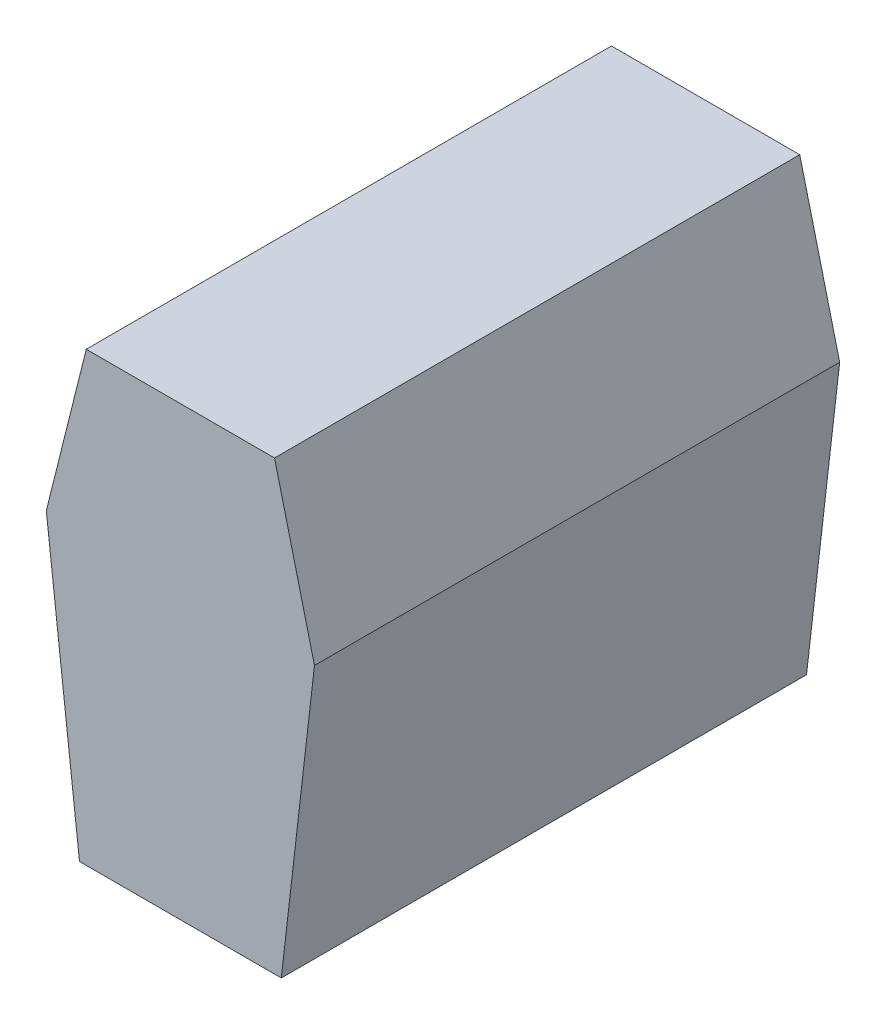
ISO-10303-21;
HEADER;
FILE_DESCRIPTION(('STEP AP214'),'2;1');
FILE_NAME('part.step','',(''),(''),'','','');
FILE_SCHEMA(('AUTOMOTIVE_DESIGN { 1 0 10303 214 1 1 1 1 }'));
ENDSEC;
DATA;
#1=APPLICATION_CONTEXT('core data for automotive mechanical design processes');
#2=APPLICATION_PROTOCOL_DEFINITION('international standard','automotive_design',2000,#1);
#3=PRODUCT_CONTEXT('',#1,'mechanical');
#4=PRODUCT('Part','Part','',(#3));
#5=PRODUCT_RELATED_PRODUCT_CATEGORY('part','',(#4));
#6=PRODUCT_DEFINITION_FORMATION('','',#4);
#7=PRODUCT_DEFINITION_CONTEXT('part definition',#1,'design');
#8=PRODUCT_DEFINITION('design','',#6,#7);
#9=PRODUCT_DEFINITION_SHAPE('','',#8);
#10=(LENGTH_UNIT() NAMED_UNIT(*) SI_UNIT(.MILLI.,.METRE.));
#11=(NAMED_UNIT(*) PLANE_ANGLE_UNIT() SI_UNIT($,.RADIAN.));
#12=(NAMED_UNIT(*) SI_UNIT($,.STERADIAN.) SOLID_ANGLE_UNIT());
#13=UNCERTAINTY_MEASURE_WITH_UNIT(LENGTH_MEASURE(1.E-05),#10,'distance_accuracy_value','');
#14=(GEOMETRIC_REPRESENTATION_CONTEXT(3) GLOBAL_UNCERTAINTY_ASSIGNED_CONTEXT((#13)) GLOBAL_UNIT_ASSIGNED_CONTEXT((#10,
#11,#12)) REPRESENTATION_CONTEXT('',''));
#15=CARTESIAN_POINT('',(0.,0.,0.));
#16=DIRECTION('',(0.,0.,1.));
#17=DIRECTION('',(1.,0.,0.));
#18=AXIS2_PLACEMENT_3D('',#15,#16,#17);
#19=CARTESIAN_POINT('',(0.,36.907372929588,32.9));
#20=DIRECTION('',(0.,0.,-1.));
#21=DIRECTION('',(0.,-1.,0.));
#22=AXIS2_PLACEMENT_3D('',#19,#20,#21);
#23=PLANE('',#22);
#24=DIRECTION('',(-1.,0.,0.));
#25=VECTOR('',#24,1.);
#26=CARTESIAN_POINT('',(6.321026426688,23.,32.9));
#27=LINE('',#26,#25);
#28=CARTESIAN_POINT('',(6.321026426688,23.,32.9));
#29=VERTEX_POINT('',#28);
#30=CARTESIAN_POINT('',(-6.321026426688,23.,32.9));
#31=VERTEX_POINT('',#30);
#32=EDGE_CURVE('E23',#29,#31,#27,.T.);
#33=ORIENTED_EDGE('',*,*,#32,.F.);
#34=DIRECTION('',(-0.114699601764954,-0.993400222143604,0.));
#35=VECTOR('',#34,1.);
#36=CARTESIAN_POINT('',(8.398573201787,40.99339663029,32.9));
#37=LINE('',#36,#35);
#38=CARTESIAN_POINT('',(8.398573201787,40.99339663029,32.9));
#39=VERTEX_POINT('',#38);
#40=EDGE_CURVE('E140',#39,#29,#37,.T.);
#41=ORIENTED_EDGE('',*,*,#40,.F.);
#42=DIRECTION('',(0.242535625036098,-0.970142500145391,0.));
#43=VECTOR('',#42,1.);
#44=CARTESIAN_POINT('',(5.89692235936,51.,32.9));
#45=LINE('',#44,#43);
#46=CARTESIAN_POINT('',(5.89692235936,51.,32.9));
#47=VERTEX_POINT('',#46);
#48=EDGE_CURVE('E120',#47,#39,#45,.T.);
#49=ORIENTED_EDGE('',*,*,#48,.F.);
#50=DIRECTION('',(1.,0.,0.));
#51=VECTOR('',#50,1.);
#52=CARTESIAN_POINT('',(-5.89692235936,51.,32.9));
#53=LINE('',#52,#51);
#54=CARTESIAN_POINT('',(-5.89692235936,51.,32.9));
#55=VERTEX_POINT('',#54);
#56=EDGE_CURVE('E126',#55,#47,#53,.T.);
#57=ORIENTED_EDGE('',*,*,#56,.F.);
#58=DIRECTION('',(0.242535625036098,0.970142500145391,0.));
#59=VECTOR('',#58,1.);
#60=CARTESIAN_POINT('',(-8.398573201787,40.99339663029,32.9));
#61=LINE('',#60,#59);
#62=CARTESIAN_POINT('',(-8.398573201787,40.99339663029,32.9));
#63=VERTEX_POINT('',#62);
#64=EDGE_CURVE('E98',#63,#55,#61,.T.);
#65=ORIENTED_EDGE('',*,*,#64,.F.);
#66=DIRECTION('',(-0.114699601764954,0.993400222143604,0.));
#67=VECTOR('',#66,1.);
#68=CARTESIAN_POINT('',(-6.321026426688,23.,32.9));
#69=LINE('',#68,#67);
#70=EDGE_CURVE('E105',#31,#63,#69,.T.);
#71=ORIENTED_EDGE('',*,*,#70,.F.);
#72=EDGE_LOOP('',(#33,#41,#49,#57,#65,#71));
#73=FACE_BOUND('',#72,.T.);
#74=ADVANCED_FACE('F15',(#73),#23,.F.);
#75=CARTESIAN_POINT('',(0.,36.907372929588,0.));
#76=DIRECTION('',(0.,0.,-1.));
#77=DIRECTION('',(0.,-1.,0.));
#78=AXIS2_PLACEMENT_3D('',#75,#76,#77);
#79=PLANE('',#78);
#80=DIRECTION('',(-0.114699601764954,0.993400222143604,0.));
#81=VECTOR('',#80,1.);
#82=CARTESIAN_POINT('',(-6.321026426688,23.,0.));
#83=LINE('',#82,#81);
#84=CARTESIAN_POINT('',(-6.321026426688,23.,0.));
#85=VERTEX_POINT('',#84);
#86=CARTESIAN_POINT('',(-8.398573201787,40.99339663029,0.));
#87=VERTEX_POINT('',#86);
#88=EDGE_CURVE('E84',#85,#87,#83,.T.);
#89=ORIENTED_EDGE('',*,*,#88,.T.);
#90=DIRECTION('',(0.242535625036098,0.970142500145391,0.));
#91=VECTOR('',#90,1.);
#92=CARTESIAN_POINT('',(-8.398573201787,40.99339663029,0.));
#93=LINE('',#92,#91);
#94=CARTESIAN_POINT('',(-5.89692235936,51.,0.));
#95=VERTEX_POINT('',#94);
#96=EDGE_CURVE('E131',#87,#95,#93,.T.);
#97=ORIENTED_EDGE('',*,*,#96,.T.);
#98=DIRECTION('',(1.,0.,0.));
#99=VECTOR('',#98,1.);
#100=CARTESIAN_POINT('',(-5.89692235936,51.,0.));
#101=LINE('',#100,#99);
#102=CARTESIAN_POINT('',(5.89692235936,51.,0.));
#103=VERTEX_POINT('',#102);
#104=EDGE_CURVE('E124',#95,#103,#101,.T.);
#105=ORIENTED_EDGE('',*,*,#104,.T.);
#106=DIRECTION('',(0.242535625036098,-0.970142500145391,0.));
#107=VECTOR('',#106,1.);
#108=CARTESIAN_POINT('',(5.89692235936,51.,0.));
#109=LINE('',#108,#107);
#110=CARTESIAN_POINT('',(8.398573201787,40.99339663029,0.));
#111=VERTEX_POINT('',#110);
#112=EDGE_CURVE('E118',#103,#111,#109,.T.);
#113=ORIENTED_EDGE('',*,*,#112,.T.);
#114=DIRECTION('',(-0.114699601764954,-0.993400222143604,0.));
#115=VECTOR('',#114,1.);
#116=CARTESIAN_POINT('',(8.398573201787,40.99339663029,0.));
#117=LINE('',#116,#115);
#118=CARTESIAN_POINT('',(6.321026426688,23.,0.));
#119=VERTEX_POINT('',#118);
#120=EDGE_CURVE('E86',#111,#119,#117,.T.);
#121=ORIENTED_EDGE('',*,*,#120,.T.);
#122=DIRECTION('',(-1.,0.,0.));
#123=VECTOR('',#122,1.);
#124=CARTESIAN_POINT('',(6.321026426688,23.,0.));
#125=LINE('',#124,#123);
#126=EDGE_CURVE('E9',#119,#85,#125,.T.);
#127=ORIENTED_EDGE('',*,*,#126,.T.);
#128=EDGE_LOOP('',(#89,#97,#105,#113,#121,#127));
#129=FACE_BOUND('',#128,.T.);
#130=ADVANCED_FACE('F83',(#129),#79,.T.);
#131=CARTESIAN_POINT('',(6.321026426688,23.,0.));
#132=DIRECTION('',(0.,-1.,0.));
#133=DIRECTION('',(0.,0.,-1.));
#134=AXIS2_PLACEMENT_3D('',#131,#132,#133);
#135=PLANE('',#134);
#136=DIRECTION('',(0.,0.,1.));
#137=VECTOR('',#136,1.);
#138=CARTESIAN_POINT('',(6.321026426688,23.,0.));
#139=LINE('',#138,#137);
#140=EDGE_CURVE('E143',#119,#29,#139,.T.);
#141=ORIENTED_EDGE('',*,*,#140,.T.);
#142=ORIENTED_EDGE('',*,*,#32,.T.);
#143=DIRECTION('',(0.,0.,1.));
#144=VECTOR('',#143,1.);
#145=CARTESIAN_POINT('',(-6.321026426688,23.,0.));
#146=LINE('',#145,#144);
#147=EDGE_CURVE('E94',#85,#31,#146,.T.);
#148=ORIENTED_EDGE('',*,*,#147,.F.);
#149=ORIENTED_EDGE('',*,*,#126,.F.);
#150=EDGE_LOOP('',(#141,#142,#148,#149));
#151=FACE_BOUND('',#150,.T.);
#152=ADVANCED_FACE('F99',(#151),#135,.T.);
#153=CARTESIAN_POINT('',(8.398573201787,40.99339663029,0.));
#154=DIRECTION('',(0.993400222143604,-0.114699601764954,0.));
#155=DIRECTION('',(0.,0.,-1.));
#156=AXIS2_PLACEMENT_3D('',#153,#154,#155);
#157=PLANE('',#156);
#158=DIRECTION('',(0.,0.,1.));
#159=VECTOR('',#158,1.);
#160=CARTESIAN_POINT('',(8.398573201787,40.99339663029,0.));
#161=LINE('',#160,#159);
#162=EDGE_CURVE('E113',#111,#39,#161,.T.);
#163=ORIENTED_EDGE('',*,*,#162,.T.);
#164=ORIENTED_EDGE('',*,*,#40,.T.);
#165=ORIENTED_EDGE('',*,*,#140,.F.);
#166=ORIENTED_EDGE('',*,*,#120,.F.);
#167=EDGE_LOOP('',(#163,#164,#165,#166));
#168=FACE_BOUND('',#167,.T.);
#169=ADVANCED_FACE('F197',(#168),#157,.T.);
#170=CARTESIAN_POINT('',(5.89692235936,51.,0.));
#171=DIRECTION('',(0.970142500145391,0.242535625036098,0.));
#172=DIRECTION('',(0.,0.,-1.));
#173=AXIS2_PLACEMENT_3D('',#170,#171,#172);
#174=PLANE('',#173);
#175=DIRECTION('',(0.,0.,1.));
#176=VECTOR('',#175,1.);
#177=CARTESIAN_POINT('',(5.89692235936,51.,0.));
#178=LINE('',#177,#176);
#179=EDGE_CURVE('E112',#103,#47,#178,.T.);
#180=ORIENTED_EDGE('',*,*,#179,.T.);
#181=ORIENTED_EDGE('',*,*,#48,.T.);
#182=ORIENTED_EDGE('',*,*,#162,.F.);
#183=ORIENTED_EDGE('',*,*,#112,.F.);
#184=EDGE_LOOP('',(#180,#181,#182,#183));
#185=FACE_BOUND('',#184,.T.);
#186=ADVANCED_FACE('F177',(#185),#174,.T.);
#187=CARTESIAN_POINT('',(-5.89692235936,51.,0.));
#188=DIRECTION('',(0.,1.,0.));
#189=DIRECTION('',(1.,0.,0.));
#190=AXIS2_PLACEMENT_3D('',#187,#188,#189);
#191=PLANE('',#190);
#192=DIRECTION('',(0.,0.,1.));
#193=VECTOR('',#192,1.);
#194=CARTESIAN_POINT('',(-5.89692235936,51.,0.));
#195=LINE('',#194,#193);
#196=EDGE_CURVE('E114',#95,#55,#195,.T.);
#197=ORIENTED_EDGE('',*,*,#196,.T.);
#198=ORIENTED_EDGE('',*,*,#56,.T.);
#199=ORIENTED_EDGE('',*,*,#179,.F.);
#200=ORIENTED_EDGE('',*,*,#104,.F.);
#201=EDGE_LOOP('',(#197,#198,#199,#200));
#202=FACE_BOUND('',#201,.T.);
#203=ADVANCED_FACE('F168',(#202),#191,.T.);
#204=CARTESIAN_POINT('',(-8.398573201787,40.99339663029,0.));
#205=DIRECTION('',(-0.970142500145391,0.242535625036098,0.));
#206=DIRECTION('',(0.,0.,1.));
#207=AXIS2_PLACEMENT_3D('',#204,#205,#206);
#208=PLANE('',#207);
#209=DIRECTION('',(0.,0.,1.));
#210=VECTOR('',#209,1.);
#211=CARTESIAN_POINT('',(-8.398573201787,40.99339663029,0.));
#212=LINE('',#211,#210);
#213=EDGE_CURVE('E96',#87,#63,#212,.T.);
#214=ORIENTED_EDGE('',*,*,#213,.T.);
#215=ORIENTED_EDGE('',*,*,#64,.T.);
#216=ORIENTED_EDGE('',*,*,#196,.F.);
#217=ORIENTED_EDGE('',*,*,#96,.F.);
#218=EDGE_LOOP('',(#214,#215,#216,#217));
#219=FACE_BOUND('',#218,.T.);
#220=ADVANCED_FACE('F161',(#219),#208,.T.);
#221=CARTESIAN_POINT('',(-6.321026426688,23.,0.));
#222=DIRECTION('',(-0.993400222143604,-0.114699601764954,0.));
#223=DIRECTION('',(-0.114699601764954,0.993400222143604,0.));
#224=AXIS2_PLACEMENT_3D('',#221,#222,#223);
#225=PLANE('',#224);
#226=ORIENTED_EDGE('',*,*,#147,.T.);
#227=ORIENTED_EDGE('',*,*,#70,.T.);
#228=ORIENTED_EDGE('',*,*,#213,.F.);
#229=ORIENTED_EDGE('',*,*,#88,.F.);
#230=EDGE_LOOP('',(#226,#227,#228,#229));
#231=FACE_BOUND('',#230,.T.);
#232=ADVANCED_FACE('F95',(#231),#225,.T.);
#233=CLOSED_SHELL('',(#74,#130,#152,#169,#186,#203,#220,#232));
#234=MANIFOLD_SOLID_BREP('B1',#233);
#235=ADVANCED_BREP_SHAPE_REPRESENTATION('',(#18,#234),#14);
#236=SHAPE_DEFINITION_REPRESENTATION(#9,#235);
ENDSEC;
END-ISO-10303-21;
